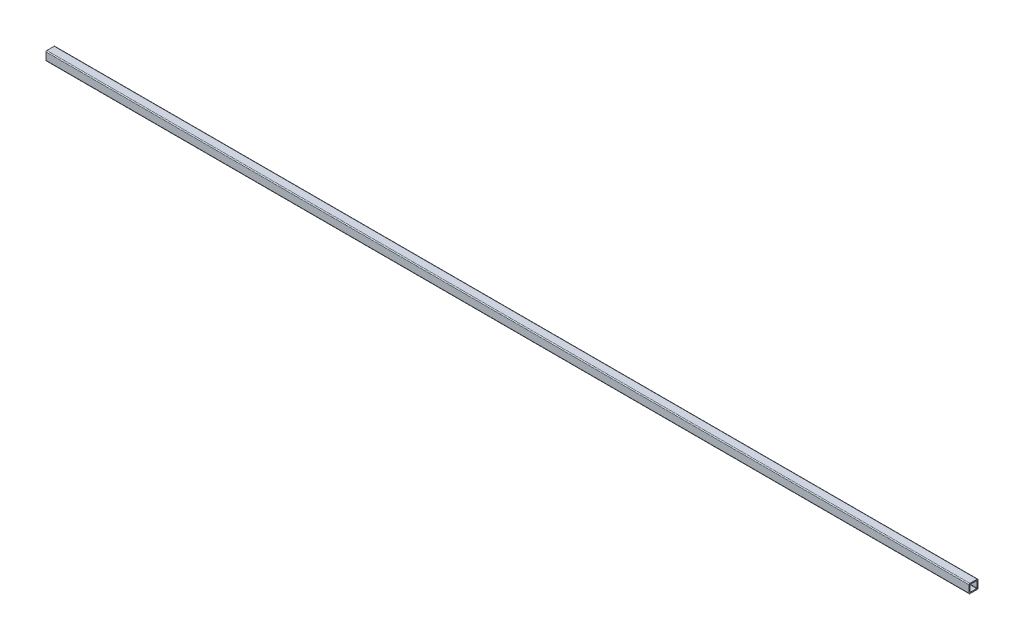
ISO-10303-21;
HEADER;
FILE_DESCRIPTION(('STEP AP214'),'2;1');
FILE_NAME('part.step','',(''),(''),'','','');
FILE_SCHEMA(('AUTOMOTIVE_DESIGN { 1 0 10303 214 1 1 1 1 }'));
ENDSEC;
DATA;
#1=APPLICATION_CONTEXT('core data for automotive mechanical design processes');
#2=APPLICATION_PROTOCOL_DEFINITION('international standard','automotive_design',2000,#1);
#3=PRODUCT_CONTEXT('',#1,'mechanical');
#4=PRODUCT('Part','Part','',(#3));
#5=PRODUCT_RELATED_PRODUCT_CATEGORY('part','',(#4));
#6=PRODUCT_DEFINITION_FORMATION('','',#4);
#7=PRODUCT_DEFINITION_CONTEXT('part definition',#1,'design');
#8=PRODUCT_DEFINITION('design','',#6,#7);
#9=PRODUCT_DEFINITION_SHAPE('','',#8);
#10=(LENGTH_UNIT() NAMED_UNIT(*) SI_UNIT(.MILLI.,.METRE.));
#11=(NAMED_UNIT(*) PLANE_ANGLE_UNIT() SI_UNIT($,.RADIAN.));
#12=(NAMED_UNIT(*) SI_UNIT($,.STERADIAN.) SOLID_ANGLE_UNIT());
#13=UNCERTAINTY_MEASURE_WITH_UNIT(LENGTH_MEASURE(1.E-05),#10,'distance_accuracy_value','');
#14=(GEOMETRIC_REPRESENTATION_CONTEXT(3) GLOBAL_UNCERTAINTY_ASSIGNED_CONTEXT((#13)) GLOBAL_UNIT_ASSIGNED_CONTEXT((#10,
#11,#12)) REPRESENTATION_CONTEXT('',''));
#15=CARTESIAN_POINT('',(0.,0.,0.));
#16=DIRECTION('',(0.,0.,1.));
#17=DIRECTION('',(1.,0.,0.));
#18=AXIS2_PLACEMENT_3D('',#15,#16,#17);
#19=CARTESIAN_POINT('',(-2610.,12.7,-12.7));
#20=DIRECTION('',(0.,0.,-1.));
#21=DIRECTION('',(0.,1.,0.));
#22=AXIS2_PLACEMENT_3D('',#19,#20,#21);
#23=PLANE('',#22);
#24=DIRECTION('',(0.,1.,0.));
#25=VECTOR('',#24,1.);
#26=CARTESIAN_POINT('',(0.,12.7,-12.7));
#27=LINE('',#26,#25);
#28=CARTESIAN_POINT('',(0.,-10.2,-12.7));
#29=VERTEX_POINT('',#28);
#30=CARTESIAN_POINT('',(0.,10.2,-12.7));
#31=VERTEX_POINT('',#30);
#32=EDGE_CURVE('E276',#29,#31,#27,.T.);
#33=ORIENTED_EDGE('',*,*,#32,.F.);
#34=DIRECTION('',(1.,0.,0.));
#35=VECTOR('',#34,1.);
#36=CARTESIAN_POINT('',(-2610.,-10.2,-12.7));
#37=LINE('',#36,#35);
#38=CARTESIAN_POINT('',(-2610.,-10.2,-12.7));
#39=VERTEX_POINT('',#38);
#40=EDGE_CURVE('E193',#29,#39,#37,.F.);
#41=ORIENTED_EDGE('',*,*,#40,.T.);
#42=DIRECTION('',(0.,1.,0.));
#43=VECTOR('',#42,1.);
#44=CARTESIAN_POINT('',(-2610.,12.7,-12.7));
#45=LINE('',#44,#43);
#46=CARTESIAN_POINT('',(-2610.,10.2,-12.7));
#47=VERTEX_POINT('',#46);
#48=EDGE_CURVE('E170',#39,#47,#45,.T.);
#49=ORIENTED_EDGE('',*,*,#48,.T.);
#50=DIRECTION('',(1.,0.,0.));
#51=VECTOR('',#50,1.);
#52=CARTESIAN_POINT('',(-2610.,10.2,-12.7));
#53=LINE('',#52,#51);
#54=EDGE_CURVE('E189',#47,#31,#53,.T.);
#55=ORIENTED_EDGE('',*,*,#54,.T.);
#56=EDGE_LOOP('',(#33,#41,#49,#55));
#57=FACE_BOUND('',#56,.T.);
#58=ADVANCED_FACE('F35',(#57),#23,.T.);
#59=CARTESIAN_POINT('',(-2610.,-12.7,12.7));
#60=DIRECTION('',(0.,-1.,0.));
#61=DIRECTION('',(0.,0.,-1.));
#62=AXIS2_PLACEMENT_3D('',#59,#60,#61);
#63=PLANE('',#62);
#64=DIRECTION('',(0.,0.,-1.));
#65=VECTOR('',#64,1.);
#66=CARTESIAN_POINT('',(-2610.,-12.7,12.7));
#67=LINE('',#66,#65);
#68=CARTESIAN_POINT('',(-2610.,-12.7,10.2));
#69=VERTEX_POINT('',#68);
#70=CARTESIAN_POINT('',(-2610.,-12.7,-10.2));
#71=VERTEX_POINT('',#70);
#72=EDGE_CURVE('E176',#69,#71,#67,.T.);
#73=ORIENTED_EDGE('',*,*,#72,.T.);
#74=DIRECTION('',(1.,0.,0.));
#75=VECTOR('',#74,1.);
#76=CARTESIAN_POINT('',(-2610.,-12.7,-10.2));
#77=LINE('',#76,#75);
#78=CARTESIAN_POINT('',(0.,-12.7,-10.2));
#79=VERTEX_POINT('',#78);
#80=EDGE_CURVE('E169',#71,#79,#77,.T.);
#81=ORIENTED_EDGE('',*,*,#80,.T.);
#82=DIRECTION('',(0.,0.,-1.));
#83=VECTOR('',#82,1.);
#84=CARTESIAN_POINT('',(0.,-12.7,12.7));
#85=LINE('',#84,#83);
#86=CARTESIAN_POINT('',(0.,-12.7,10.2));
#87=VERTEX_POINT('',#86);
#88=EDGE_CURVE('E152',#87,#79,#85,.T.);
#89=ORIENTED_EDGE('',*,*,#88,.F.);
#90=DIRECTION('',(1.,0.,0.));
#91=VECTOR('',#90,1.);
#92=CARTESIAN_POINT('',(-2610.,-12.7,10.2));
#93=LINE('',#92,#91);
#94=EDGE_CURVE('E166',#87,#69,#93,.F.);
#95=ORIENTED_EDGE('',*,*,#94,.T.);
#96=EDGE_LOOP('',(#73,#81,#89,#95));
#97=FACE_BOUND('',#96,.T.);
#98=ADVANCED_FACE('F165',(#97),#63,.T.);
#99=CARTESIAN_POINT('',(-2610.,12.7,12.7));
#100=DIRECTION('',(0.,0.,1.));
#101=DIRECTION('',(0.,-1.,0.));
#102=AXIS2_PLACEMENT_3D('',#99,#100,#101);
#103=PLANE('',#102);
#104=DIRECTION('',(0.,-1.,0.));
#105=VECTOR('',#104,1.);
#106=CARTESIAN_POINT('',(-2610.,12.7,12.7));
#107=LINE('',#106,#105);
#108=CARTESIAN_POINT('',(-2610.,10.2,12.7));
#109=VERTEX_POINT('',#108);
#110=CARTESIAN_POINT('',(-2610.,-10.2,12.7));
#111=VERTEX_POINT('',#110);
#112=EDGE_CURVE('E182',#109,#111,#107,.T.);
#113=ORIENTED_EDGE('',*,*,#112,.T.);
#114=DIRECTION('',(1.,0.,0.));
#115=VECTOR('',#114,1.);
#116=CARTESIAN_POINT('',(-2610.,-10.2,12.7));
#117=LINE('',#116,#115);
#118=CARTESIAN_POINT('',(0.,-10.2,12.7));
#119=VERTEX_POINT('',#118);
#120=EDGE_CURVE('E206',#111,#119,#117,.T.);
#121=ORIENTED_EDGE('',*,*,#120,.T.);
#122=DIRECTION('',(0.,-1.,0.));
#123=VECTOR('',#122,1.);
#124=CARTESIAN_POINT('',(0.,12.7,12.7));
#125=LINE('',#124,#123);
#126=CARTESIAN_POINT('',(0.,10.2,12.7));
#127=VERTEX_POINT('',#126);
#128=EDGE_CURVE('E154',#127,#119,#125,.T.);
#129=ORIENTED_EDGE('',*,*,#128,.F.);
#130=DIRECTION('',(1.,0.,0.));
#131=VECTOR('',#130,1.);
#132=CARTESIAN_POINT('',(-2610.,10.2,12.7));
#133=LINE('',#132,#131);
#134=EDGE_CURVE('E203',#127,#109,#133,.F.);
#135=ORIENTED_EDGE('',*,*,#134,.T.);
#136=EDGE_LOOP('',(#113,#121,#129,#135));
#137=FACE_BOUND('',#136,.T.);
#138=ADVANCED_FACE('F320',(#137),#103,.T.);
#139=CARTESIAN_POINT('',(-2610.,12.7,12.7));
#140=DIRECTION('',(0.,1.,0.));
#141=DIRECTION('',(0.,0.,1.));
#142=AXIS2_PLACEMENT_3D('',#139,#140,#141);
#143=PLANE('',#142);
#144=DIRECTION('',(0.,0.,1.));
#145=VECTOR('',#144,1.);
#146=CARTESIAN_POINT('',(0.,12.7,12.7));
#147=LINE('',#146,#145);
#148=CARTESIAN_POINT('',(0.,12.7,-10.2));
#149=VERTEX_POINT('',#148);
#150=CARTESIAN_POINT('',(0.,12.7,10.2));
#151=VERTEX_POINT('',#150);
#152=EDGE_CURVE('E279',#149,#151,#147,.T.);
#153=ORIENTED_EDGE('',*,*,#152,.F.);
#154=DIRECTION('',(1.,0.,0.));
#155=VECTOR('',#154,1.);
#156=CARTESIAN_POINT('',(-2610.,12.7,-10.2));
#157=LINE('',#156,#155);
#158=CARTESIAN_POINT('',(-2610.,12.7,-10.2));
#159=VERTEX_POINT('',#158);
#160=EDGE_CURVE('E212',#149,#159,#157,.F.);
#161=ORIENTED_EDGE('',*,*,#160,.T.);
#162=DIRECTION('',(0.,0.,1.));
#163=VECTOR('',#162,1.);
#164=CARTESIAN_POINT('',(-2610.,12.7,12.7));
#165=LINE('',#164,#163);
#166=CARTESIAN_POINT('',(-2610.,12.7,10.2));
#167=VERTEX_POINT('',#166);
#168=EDGE_CURVE('E294',#159,#167,#165,.T.);
#169=ORIENTED_EDGE('',*,*,#168,.T.);
#170=DIRECTION('',(1.,0.,0.));
#171=VECTOR('',#170,1.);
#172=CARTESIAN_POINT('',(-2610.,12.7,10.2));
#173=LINE('',#172,#171);
#174=EDGE_CURVE('E208',#167,#151,#173,.T.);
#175=ORIENTED_EDGE('',*,*,#174,.T.);
#176=EDGE_LOOP('',(#153,#161,#169,#175));
#177=FACE_BOUND('',#176,.T.);
#178=ADVANCED_FACE('F303',(#177),#143,.T.);
#179=CARTESIAN_POINT('',(-2610.,0.,0.));
#180=DIRECTION('',(1.,0.,0.));
#181=DIRECTION('',(0.,0.,-1.));
#182=AXIS2_PLACEMENT_3D('',#179,#180,#181);
#183=PLANE('',#182);
#184=DIRECTION('',(0.,-1.,0.));
#185=VECTOR('',#184,1.);
#186=CARTESIAN_POINT('',(-2610.,-9.652,9.652));
#187=LINE('',#186,#185);
#188=CARTESIAN_POINT('',(-2610.,8.652,9.652));
#189=VERTEX_POINT('',#188);
#190=CARTESIAN_POINT('',(-2610.,-8.652,9.652));
#191=VERTEX_POINT('',#190);
#192=EDGE_CURVE('E272',#189,#191,#187,.T.);
#193=ORIENTED_EDGE('',*,*,#192,.T.);
#194=CARTESIAN_POINT('',(-2610.,-8.652,8.652));
#195=DIRECTION('',(1.,0.,0.));
#196=DIRECTION('',(0.,0.,-1.));
#197=AXIS2_PLACEMENT_3D('',#194,#195,#196);
#198=CIRCLE('',#197,1.);
#199=CARTESIAN_POINT('',(-2610.,-9.652,8.652));
#200=VERTEX_POINT('',#199);
#201=EDGE_CURVE('E11',#191,#200,#198,.T.);
#202=ORIENTED_EDGE('',*,*,#201,.T.);
#203=DIRECTION('',(0.,0.,-1.));
#204=VECTOR('',#203,1.);
#205=CARTESIAN_POINT('',(-2610.,-9.652,9.652));
#206=LINE('',#205,#204);
#207=CARTESIAN_POINT('',(-2610.,-9.652,-8.652));
#208=VERTEX_POINT('',#207);
#209=EDGE_CURVE('E270',#200,#208,#206,.T.);
#210=ORIENTED_EDGE('',*,*,#209,.T.);
#211=CARTESIAN_POINT('',(-2610.,-8.652,-8.652));
#212=DIRECTION('',(1.,0.,0.));
#213=DIRECTION('',(0.,0.,-1.));
#214=AXIS2_PLACEMENT_3D('',#211,#212,#213);
#215=CIRCLE('',#214,1.);
#216=CARTESIAN_POINT('',(-2610.,-8.652,-9.652));
#217=VERTEX_POINT('',#216);
#218=EDGE_CURVE('E244',#208,#217,#215,.T.);
#219=ORIENTED_EDGE('',*,*,#218,.T.);
#220=DIRECTION('',(0.,1.,0.));
#221=VECTOR('',#220,1.);
#222=CARTESIAN_POINT('',(-2610.,-9.652,-9.652));
#223=LINE('',#222,#221);
#224=CARTESIAN_POINT('',(-2610.,8.652,-9.652));
#225=VERTEX_POINT('',#224);
#226=EDGE_CURVE('E291',#217,#225,#223,.T.);
#227=ORIENTED_EDGE('',*,*,#226,.T.);
#228=CARTESIAN_POINT('',(-2610.,8.652,-8.652));
#229=DIRECTION('',(1.,0.,0.));
#230=DIRECTION('',(0.,0.,-1.));
#231=AXIS2_PLACEMENT_3D('',#228,#229,#230);
#232=CIRCLE('',#231,1.);
#233=CARTESIAN_POINT('',(-2610.,9.652,-8.652));
#234=VERTEX_POINT('',#233);
#235=EDGE_CURVE('E248',#225,#234,#232,.T.);
#236=ORIENTED_EDGE('',*,*,#235,.T.);
#237=DIRECTION('',(0.,0.,1.));
#238=VECTOR('',#237,1.);
#239=CARTESIAN_POINT('',(-2610.,9.652,9.652));
#240=LINE('',#239,#238);
#241=CARTESIAN_POINT('',(-2610.,9.652,8.652));
#242=VERTEX_POINT('',#241);
#243=EDGE_CURVE('E281',#234,#242,#240,.T.);
#244=ORIENTED_EDGE('',*,*,#243,.T.);
#245=CARTESIAN_POINT('',(-2610.,8.652,8.652));
#246=DIRECTION('',(1.,0.,0.));
#247=DIRECTION('',(0.,0.,-1.));
#248=AXIS2_PLACEMENT_3D('',#245,#246,#247);
#249=CIRCLE('',#248,1.);
#250=EDGE_CURVE('E57',#242,#189,#249,.T.);
#251=ORIENTED_EDGE('',*,*,#250,.T.);
#252=EDGE_LOOP('',(#193,#202,#210,#219,#227,#236,#244,#251));
#253=FACE_BOUND('',#252,.T.);
#254=ORIENTED_EDGE('',*,*,#48,.F.);
#255=CARTESIAN_POINT('',(-2610.,-10.2,-10.2));
#256=DIRECTION('',(1.,0.,0.));
#257=DIRECTION('',(0.,0.,-1.));
#258=AXIS2_PLACEMENT_3D('',#255,#256,#257);
#259=CIRCLE('',#258,2.5);
#260=EDGE_CURVE('E201',#39,#71,#259,.F.);
#261=ORIENTED_EDGE('',*,*,#260,.T.);
#262=ORIENTED_EDGE('',*,*,#72,.F.);
#263=CARTESIAN_POINT('',(-2610.,-10.2,10.2));
#264=DIRECTION('',(1.,0.,0.));
#265=DIRECTION('',(0.,0.,-1.));
#266=AXIS2_PLACEMENT_3D('',#263,#264,#265);
#267=CIRCLE('',#266,2.5);
#268=EDGE_CURVE('E174',#69,#111,#267,.F.);
#269=ORIENTED_EDGE('',*,*,#268,.T.);
#270=ORIENTED_EDGE('',*,*,#112,.F.);
#271=CARTESIAN_POINT('',(-2610.,10.2,10.2));
#272=DIRECTION('',(1.,0.,0.));
#273=DIRECTION('',(0.,0.,-1.));
#274=AXIS2_PLACEMENT_3D('',#271,#272,#273);
#275=CIRCLE('',#274,2.5);
#276=EDGE_CURVE('E196',#109,#167,#275,.F.);
#277=ORIENTED_EDGE('',*,*,#276,.T.);
#278=ORIENTED_EDGE('',*,*,#168,.F.);
#279=CARTESIAN_POINT('',(-2610.,10.2,-10.2));
#280=DIRECTION('',(1.,0.,0.));
#281=DIRECTION('',(0.,0.,-1.));
#282=AXIS2_PLACEMENT_3D('',#279,#280,#281);
#283=CIRCLE('',#282,2.5);
#284=EDGE_CURVE('E198',#159,#47,#283,.F.);
#285=ORIENTED_EDGE('',*,*,#284,.T.);
#286=EDGE_LOOP('',(#254,#261,#262,#269,#270,#277,#278,#285));
#287=FACE_BOUND('',#286,.T.);
#288=ADVANCED_FACE('F268',(#253,#287),#183,.F.);
#289=CARTESIAN_POINT('',(0.,0.,0.));
#290=DIRECTION('',(1.,0.,0.));
#291=DIRECTION('',(0.,0.,-1.));
#292=AXIS2_PLACEMENT_3D('',#289,#290,#291);
#293=PLANE('',#292);
#294=DIRECTION('',(0.,1.,0.));
#295=VECTOR('',#294,1.);
#296=CARTESIAN_POINT('',(0.,-9.652,-9.652));
#297=LINE('',#296,#295);
#298=CARTESIAN_POINT('',(0.,-8.652,-9.652));
#299=VERTEX_POINT('',#298);
#300=CARTESIAN_POINT('',(0.,8.652,-9.652));
#301=VERTEX_POINT('',#300);
#302=EDGE_CURVE('E285',#299,#301,#297,.T.);
#303=ORIENTED_EDGE('',*,*,#302,.F.);
#304=CARTESIAN_POINT('',(0.,-8.652,-8.652));
#305=DIRECTION('',(1.,0.,0.));
#306=DIRECTION('',(0.,0.,-1.));
#307=AXIS2_PLACEMENT_3D('',#304,#305,#306);
#308=CIRCLE('',#307,1.);
#309=CARTESIAN_POINT('',(0.,-9.652,-8.652));
#310=VERTEX_POINT('',#309);
#311=EDGE_CURVE('E242',#299,#310,#308,.F.);
#312=ORIENTED_EDGE('',*,*,#311,.T.);
#313=DIRECTION('',(0.,0.,-1.));
#314=VECTOR('',#313,1.);
#315=CARTESIAN_POINT('',(0.,-9.652,9.652));
#316=LINE('',#315,#314);
#317=CARTESIAN_POINT('',(0.,-9.652,8.652));
#318=VERTEX_POINT('',#317);
#319=EDGE_CURVE('E258',#318,#310,#316,.T.);
#320=ORIENTED_EDGE('',*,*,#319,.F.);
#321=CARTESIAN_POINT('',(0.,-8.652,8.652));
#322=DIRECTION('',(1.,0.,0.));
#323=DIRECTION('',(0.,0.,-1.));
#324=AXIS2_PLACEMENT_3D('',#321,#322,#323);
#325=CIRCLE('',#324,1.);
#326=CARTESIAN_POINT('',(0.,-8.652,9.652));
#327=VERTEX_POINT('',#326);
#328=EDGE_CURVE('E43',#318,#327,#325,.F.);
#329=ORIENTED_EDGE('',*,*,#328,.T.);
#330=DIRECTION('',(0.,-1.,0.));
#331=VECTOR('',#330,1.);
#332=CARTESIAN_POINT('',(0.,-9.652,9.652));
#333=LINE('',#332,#331);
#334=CARTESIAN_POINT('',(0.,8.652,9.652));
#335=VERTEX_POINT('',#334);
#336=EDGE_CURVE('E256',#335,#327,#333,.T.);
#337=ORIENTED_EDGE('',*,*,#336,.F.);
#338=CARTESIAN_POINT('',(0.,8.652,8.652));
#339=DIRECTION('',(1.,0.,0.));
#340=DIRECTION('',(0.,0.,-1.));
#341=AXIS2_PLACEMENT_3D('',#338,#339,#340);
#342=CIRCLE('',#341,1.);
#343=CARTESIAN_POINT('',(0.,9.652,8.652));
#344=VERTEX_POINT('',#343);
#345=EDGE_CURVE('E250',#335,#344,#342,.F.);
#346=ORIENTED_EDGE('',*,*,#345,.T.);
#347=DIRECTION('',(0.,0.,1.));
#348=VECTOR('',#347,1.);
#349=CARTESIAN_POINT('',(0.,9.652,9.652));
#350=LINE('',#349,#348);
#351=CARTESIAN_POINT('',(0.,9.652,-8.652));
#352=VERTEX_POINT('',#351);
#353=EDGE_CURVE('E263',#352,#344,#350,.T.);
#354=ORIENTED_EDGE('',*,*,#353,.F.);
#355=CARTESIAN_POINT('',(0.,8.652,-8.652));
#356=DIRECTION('',(1.,0.,0.));
#357=DIRECTION('',(0.,0.,-1.));
#358=AXIS2_PLACEMENT_3D('',#355,#356,#357);
#359=CIRCLE('',#358,1.);
#360=EDGE_CURVE('E246',#352,#301,#359,.F.);
#361=ORIENTED_EDGE('',*,*,#360,.T.);
#362=EDGE_LOOP('',(#303,#312,#320,#329,#337,#346,#354,#361));
#363=FACE_BOUND('',#362,.T.);
#364=ORIENTED_EDGE('',*,*,#88,.T.);
#365=CARTESIAN_POINT('',(0.,-10.2,-10.2));
#366=DIRECTION('',(1.,0.,0.));
#367=DIRECTION('',(0.,0.,-1.));
#368=AXIS2_PLACEMENT_3D('',#365,#366,#367);
#369=CIRCLE('',#368,2.5);
#370=EDGE_CURVE('E159',#79,#29,#369,.T.);
#371=ORIENTED_EDGE('',*,*,#370,.T.);
#372=ORIENTED_EDGE('',*,*,#32,.T.);
#373=CARTESIAN_POINT('',(0.,10.2,-10.2));
#374=DIRECTION('',(1.,0.,0.));
#375=DIRECTION('',(0.,0.,-1.));
#376=AXIS2_PLACEMENT_3D('',#373,#374,#375);
#377=CIRCLE('',#376,2.5);
#378=EDGE_CURVE('E160',#31,#149,#377,.T.);
#379=ORIENTED_EDGE('',*,*,#378,.T.);
#380=ORIENTED_EDGE('',*,*,#152,.T.);
#381=CARTESIAN_POINT('',(0.,10.2,10.2));
#382=DIRECTION('',(1.,0.,0.));
#383=DIRECTION('',(0.,0.,-1.));
#384=AXIS2_PLACEMENT_3D('',#381,#382,#383);
#385=CIRCLE('',#384,2.5);
#386=EDGE_CURVE('E180',#151,#127,#385,.T.);
#387=ORIENTED_EDGE('',*,*,#386,.T.);
#388=ORIENTED_EDGE('',*,*,#128,.T.);
#389=CARTESIAN_POINT('',(0.,-10.2,10.2));
#390=DIRECTION('',(1.,0.,0.));
#391=DIRECTION('',(0.,0.,-1.));
#392=AXIS2_PLACEMENT_3D('',#389,#390,#391);
#393=CIRCLE('',#392,2.5);
#394=EDGE_CURVE('E149',#119,#87,#393,.T.);
#395=ORIENTED_EDGE('',*,*,#394,.T.);
#396=EDGE_LOOP('',(#364,#371,#372,#379,#380,#387,#388,#395));
#397=FACE_BOUND('',#396,.T.);
#398=ADVANCED_FACE('F151',(#363,#397),#293,.T.);
#399=CARTESIAN_POINT('',(-2610.,-9.652,-9.652));
#400=DIRECTION('',(0.,0.,-1.));
#401=DIRECTION('',(-1.,0.,0.));
#402=AXIS2_PLACEMENT_3D('',#399,#400,#401);
#403=PLANE('',#402);
#404=ORIENTED_EDGE('',*,*,#226,.F.);
#405=DIRECTION('',(1.,0.,0.));
#406=VECTOR('',#405,1.);
#407=CARTESIAN_POINT('',(0.,-8.652,-9.652));
#408=LINE('',#407,#406);
#409=EDGE_CURVE('E218',#217,#299,#408,.T.);
#410=ORIENTED_EDGE('',*,*,#409,.T.);
#411=ORIENTED_EDGE('',*,*,#302,.T.);
#412=DIRECTION('',(1.,0.,0.));
#413=VECTOR('',#412,1.);
#414=CARTESIAN_POINT('',(-2610.,8.652,-9.652));
#415=LINE('',#414,#413);
#416=EDGE_CURVE('E215',#301,#225,#415,.F.);
#417=ORIENTED_EDGE('',*,*,#416,.T.);
#418=EDGE_LOOP('',(#404,#410,#411,#417));
#419=FACE_BOUND('',#418,.T.);
#420=ADVANCED_FACE('F381',(#419),#403,.F.);
#421=CARTESIAN_POINT('',(-2610.,-9.652,9.652));
#422=DIRECTION('',(0.,-1.,0.));
#423=DIRECTION('',(0.,0.,-1.));
#424=AXIS2_PLACEMENT_3D('',#421,#422,#423);
#425=PLANE('',#424);
#426=ORIENTED_EDGE('',*,*,#319,.T.);
#427=DIRECTION('',(1.,0.,0.));
#428=VECTOR('',#427,1.);
#429=CARTESIAN_POINT('',(-2610.,-9.652,-8.652));
#430=LINE('',#429,#428);
#431=EDGE_CURVE('E226',#310,#208,#430,.F.);
#432=ORIENTED_EDGE('',*,*,#431,.T.);
#433=ORIENTED_EDGE('',*,*,#209,.F.);
#434=DIRECTION('',(1.,0.,0.));
#435=VECTOR('',#434,1.);
#436=CARTESIAN_POINT('',(0.,-9.652,8.652));
#437=LINE('',#436,#435);
#438=EDGE_CURVE('E222',#200,#318,#437,.T.);
#439=ORIENTED_EDGE('',*,*,#438,.T.);
#440=EDGE_LOOP('',(#426,#432,#433,#439));
#441=FACE_BOUND('',#440,.T.);
#442=ADVANCED_FACE('F274',(#441),#425,.F.);
#443=CARTESIAN_POINT('',(-2610.,-9.652,9.652));
#444=DIRECTION('',(0.,0.,1.));
#445=DIRECTION('',(1.,0.,0.));
#446=AXIS2_PLACEMENT_3D('',#443,#444,#445);
#447=PLANE('',#446);
#448=ORIENTED_EDGE('',*,*,#192,.F.);
#449=DIRECTION('',(1.,0.,0.));
#450=VECTOR('',#449,1.);
#451=CARTESIAN_POINT('',(0.,8.652,9.652));
#452=LINE('',#451,#450);
#453=EDGE_CURVE('E238',#189,#335,#452,.T.);
#454=ORIENTED_EDGE('',*,*,#453,.T.);
#455=ORIENTED_EDGE('',*,*,#336,.T.);
#456=DIRECTION('',(1.,0.,0.));
#457=VECTOR('',#456,1.);
#458=CARTESIAN_POINT('',(-2610.,-8.652,9.652));
#459=LINE('',#458,#457);
#460=EDGE_CURVE('E50',#327,#191,#459,.F.);
#461=ORIENTED_EDGE('',*,*,#460,.T.);
#462=EDGE_LOOP('',(#448,#454,#455,#461));
#463=FACE_BOUND('',#462,.T.);
#464=ADVANCED_FACE('F261',(#463),#447,.F.);
#465=CARTESIAN_POINT('',(-2610.,9.652,9.652));
#466=DIRECTION('',(0.,1.,0.));
#467=DIRECTION('',(0.,0.,1.));
#468=AXIS2_PLACEMENT_3D('',#465,#466,#467);
#469=PLANE('',#468);
#470=ORIENTED_EDGE('',*,*,#243,.F.);
#471=DIRECTION('',(1.,0.,0.));
#472=VECTOR('',#471,1.);
#473=CARTESIAN_POINT('',(0.,9.652,-8.652));
#474=LINE('',#473,#472);
#475=EDGE_CURVE('E232',#234,#352,#474,.T.);
#476=ORIENTED_EDGE('',*,*,#475,.T.);
#477=ORIENTED_EDGE('',*,*,#353,.T.);
#478=DIRECTION('',(1.,0.,0.));
#479=VECTOR('',#478,1.);
#480=CARTESIAN_POINT('',(-2610.,9.652,8.652));
#481=LINE('',#480,#479);
#482=EDGE_CURVE('E229',#344,#242,#481,.F.);
#483=ORIENTED_EDGE('',*,*,#482,.T.);
#484=EDGE_LOOP('',(#470,#476,#477,#483));
#485=FACE_BOUND('',#484,.T.);
#486=ADVANCED_FACE('F346',(#485),#469,.F.);
#487=CARTESIAN_POINT('',(-2610.,-10.2,-10.2));
#488=DIRECTION('',(1.,0.,0.));
#489=DIRECTION('',(0.,0.,-1.));
#490=AXIS2_PLACEMENT_3D('',#487,#488,#489);
#491=CYLINDRICAL_SURFACE('',#490,2.5);
#492=ORIENTED_EDGE('',*,*,#260,.F.);
#493=ORIENTED_EDGE('',*,*,#40,.F.);
#494=ORIENTED_EDGE('',*,*,#370,.F.);
#495=ORIENTED_EDGE('',*,*,#80,.F.);
#496=EDGE_LOOP('',(#492,#493,#494,#495));
#497=FACE_BOUND('',#496,.T.);
#498=ADVANCED_FACE('F316',(#497),#491,.T.);
#499=CARTESIAN_POINT('',(-2610.,-10.2,10.2));
#500=DIRECTION('',(1.,0.,0.));
#501=DIRECTION('',(0.,0.,-1.));
#502=AXIS2_PLACEMENT_3D('',#499,#500,#501);
#503=CYLINDRICAL_SURFACE('',#502,2.5);
#504=ORIENTED_EDGE('',*,*,#268,.F.);
#505=ORIENTED_EDGE('',*,*,#94,.F.);
#506=ORIENTED_EDGE('',*,*,#394,.F.);
#507=ORIENTED_EDGE('',*,*,#120,.F.);
#508=EDGE_LOOP('',(#504,#505,#506,#507));
#509=FACE_BOUND('',#508,.T.);
#510=ADVANCED_FACE('F173',(#509),#503,.T.);
#511=CARTESIAN_POINT('',(-2610.,10.2,-10.2));
#512=DIRECTION('',(1.,0.,0.));
#513=DIRECTION('',(0.,0.,-1.));
#514=AXIS2_PLACEMENT_3D('',#511,#512,#513);
#515=CYLINDRICAL_SURFACE('',#514,2.5);
#516=ORIENTED_EDGE('',*,*,#284,.F.);
#517=ORIENTED_EDGE('',*,*,#160,.F.);
#518=ORIENTED_EDGE('',*,*,#378,.F.);
#519=ORIENTED_EDGE('',*,*,#54,.F.);
#520=EDGE_LOOP('',(#516,#517,#518,#519));
#521=FACE_BOUND('',#520,.T.);
#522=ADVANCED_FACE('F308',(#521),#515,.T.);
#523=CARTESIAN_POINT('',(-2610.,10.2,10.2));
#524=DIRECTION('',(1.,0.,0.));
#525=DIRECTION('',(0.,0.,-1.));
#526=AXIS2_PLACEMENT_3D('',#523,#524,#525);
#527=CYLINDRICAL_SURFACE('',#526,2.5);
#528=ORIENTED_EDGE('',*,*,#276,.F.);
#529=ORIENTED_EDGE('',*,*,#134,.F.);
#530=ORIENTED_EDGE('',*,*,#386,.F.);
#531=ORIENTED_EDGE('',*,*,#174,.F.);
#532=EDGE_LOOP('',(#528,#529,#530,#531));
#533=FACE_BOUND('',#532,.T.);
#534=ADVANCED_FACE('F323',(#533),#527,.T.);
#535=CARTESIAN_POINT('',(-2610.,-8.652,-8.652));
#536=DIRECTION('',(-1.,0.,0.));
#537=DIRECTION('',(0.,0.,1.));
#538=AXIS2_PLACEMENT_3D('',#535,#536,#537);
#539=CYLINDRICAL_SURFACE('',#538,1.);
#540=ORIENTED_EDGE('',*,*,#218,.F.);
#541=ORIENTED_EDGE('',*,*,#431,.F.);
#542=ORIENTED_EDGE('',*,*,#311,.F.);
#543=ORIENTED_EDGE('',*,*,#409,.F.);
#544=EDGE_LOOP('',(#540,#541,#542,#543));
#545=FACE_BOUND('',#544,.T.);
#546=ADVANCED_FACE('F325',(#545),#539,.F.);
#547=CARTESIAN_POINT('',(-2610.,8.652,-8.652));
#548=DIRECTION('',(-1.,0.,0.));
#549=DIRECTION('',(0.,0.,1.));
#550=AXIS2_PLACEMENT_3D('',#547,#548,#549);
#551=CYLINDRICAL_SURFACE('',#550,1.);
#552=ORIENTED_EDGE('',*,*,#235,.F.);
#553=ORIENTED_EDGE('',*,*,#416,.F.);
#554=ORIENTED_EDGE('',*,*,#360,.F.);
#555=ORIENTED_EDGE('',*,*,#475,.F.);
#556=EDGE_LOOP('',(#552,#553,#554,#555));
#557=FACE_BOUND('',#556,.T.);
#558=ADVANCED_FACE('F331',(#557),#551,.F.);
#559=CARTESIAN_POINT('',(-2610.,8.652,8.652));
#560=DIRECTION('',(-1.,0.,0.));
#561=DIRECTION('',(0.,0.,1.));
#562=AXIS2_PLACEMENT_3D('',#559,#560,#561);
#563=CYLINDRICAL_SURFACE('',#562,1.);
#564=ORIENTED_EDGE('',*,*,#250,.F.);
#565=ORIENTED_EDGE('',*,*,#482,.F.);
#566=ORIENTED_EDGE('',*,*,#345,.F.);
#567=ORIENTED_EDGE('',*,*,#453,.F.);
#568=EDGE_LOOP('',(#564,#565,#566,#567));
#569=FACE_BOUND('',#568,.T.);
#570=ADVANCED_FACE('F429',(#569),#563,.F.);
#571=CARTESIAN_POINT('',(-2610.,-8.652,8.652));
#572=DIRECTION('',(-1.,0.,0.));
#573=DIRECTION('',(0.,0.,1.));
#574=AXIS2_PLACEMENT_3D('',#571,#572,#573);
#575=CYLINDRICAL_SURFACE('',#574,1.);
#576=ORIENTED_EDGE('',*,*,#201,.F.);
#577=ORIENTED_EDGE('',*,*,#460,.F.);
#578=ORIENTED_EDGE('',*,*,#328,.F.);
#579=ORIENTED_EDGE('',*,*,#438,.F.);
#580=EDGE_LOOP('',(#576,#577,#578,#579));
#581=FACE_BOUND('',#580,.T.);
#582=ADVANCED_FACE('F37',(#581),#575,.F.);
#583=CLOSED_SHELL('',(#58,#98,#138,#178,#288,#398,#420,#442,#464,#486,#498,#510,#522,#534,#546,
#558,#570,#582));
#584=MANIFOLD_SOLID_BREP('B2',#583);
#585=ADVANCED_BREP_SHAPE_REPRESENTATION('',(#18,#584),#14);
#586=SHAPE_DEFINITION_REPRESENTATION(#9,#585);
ENDSEC;
END-ISO-10303-21;
